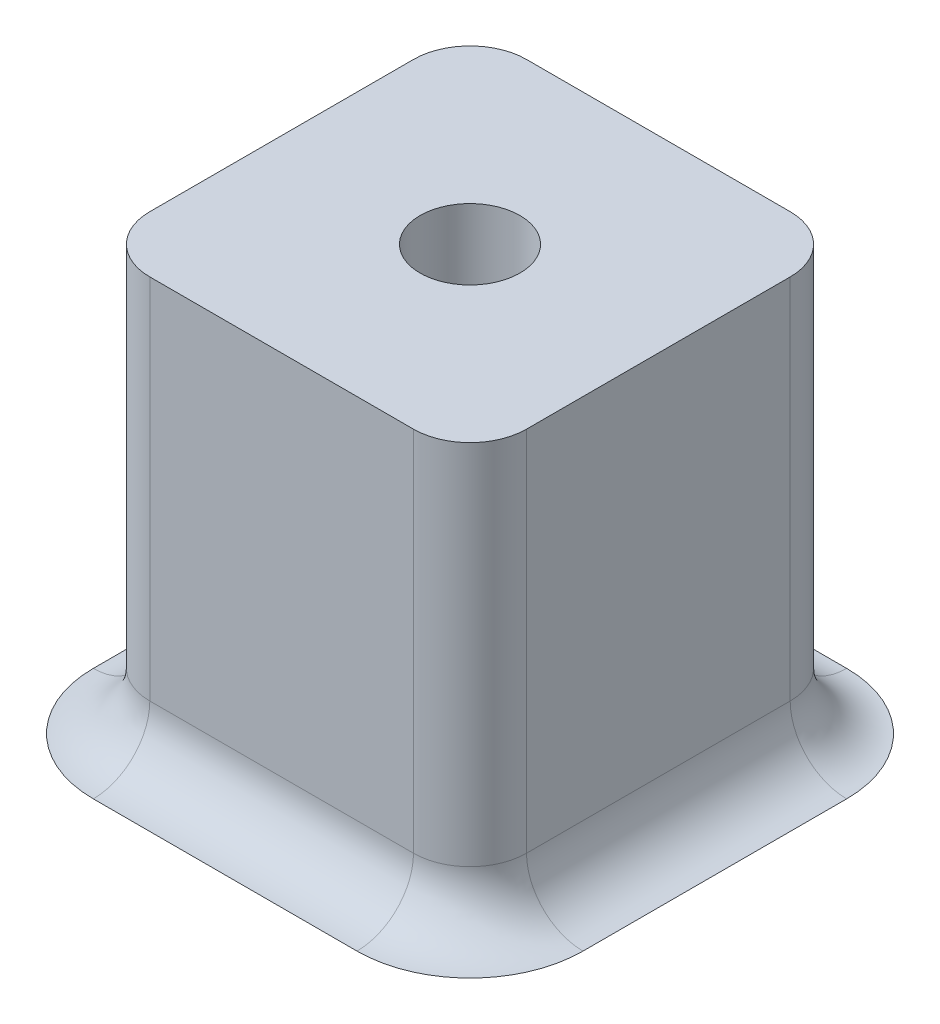
ISO-10303-21;
HEADER;
FILE_DESCRIPTION(('STEP AP214'),'2;1');
FILE_NAME('part.step','',(''),(''),'','','');
FILE_SCHEMA(('AUTOMOTIVE_DESIGN { 1 0 10303 214 1 1 1 1 }'));
ENDSEC;
DATA;
#1=APPLICATION_CONTEXT('core data for automotive mechanical design processes');
#2=APPLICATION_PROTOCOL_DEFINITION('international standard','automotive_design',2000,#1);
#3=PRODUCT_CONTEXT('',#1,'mechanical');
#4=PRODUCT('Part','Part','',(#3));
#5=PRODUCT_RELATED_PRODUCT_CATEGORY('part','',(#4));
#6=PRODUCT_DEFINITION_FORMATION('','',#4);
#7=PRODUCT_DEFINITION_CONTEXT('part definition',#1,'design');
#8=PRODUCT_DEFINITION('design','',#6,#7);
#9=PRODUCT_DEFINITION_SHAPE('','',#8);
#10=(LENGTH_UNIT() NAMED_UNIT(*) SI_UNIT(.MILLI.,.METRE.));
#11=(NAMED_UNIT(*) PLANE_ANGLE_UNIT() SI_UNIT($,.RADIAN.));
#12=(NAMED_UNIT(*) SI_UNIT($,.STERADIAN.) SOLID_ANGLE_UNIT());
#13=UNCERTAINTY_MEASURE_WITH_UNIT(LENGTH_MEASURE(1.E-05),#10,'distance_accuracy_value','');
#14=(GEOMETRIC_REPRESENTATION_CONTEXT(3) GLOBAL_UNCERTAINTY_ASSIGNED_CONTEXT((#13)) GLOBAL_UNIT_ASSIGNED_CONTEXT((#10,
#11,#12)) REPRESENTATION_CONTEXT('',''));
#15=CARTESIAN_POINT('',(0.,0.,0.));
#16=DIRECTION('',(0.,0.,1.));
#17=DIRECTION('',(1.,0.,0.));
#18=AXIS2_PLACEMENT_3D('',#15,#16,#17);
#19=CARTESIAN_POINT('',(865.,5.,-700.));
#20=DIRECTION('',(0.,1.,0.));
#21=DIRECTION('',(0.,0.,1.));
#22=AXIS2_PLACEMENT_3D('',#19,#20,#21);
#23=PLANE('',#22);
#24=DIRECTION('',(1.,0.,0.));
#25=VECTOR('',#24,1.);
#26=CARTESIAN_POINT('',(72.9999999999999,5.,-503.25));
#27=LINE('',#26,#25);
#28=CARTESIAN_POINT('',(86.9999999999999,5.,-503.25));
#29=VERTEX_POINT('',#28);
#30=CARTESIAN_POINT('',(72.9999999999999,5.,-503.25));
#31=VERTEX_POINT('',#30);
#32=EDGE_CURVE('E138',#29,#31,#27,.F.);
#33=ORIENTED_EDGE('',*,*,#32,.T.);
#34=CARTESIAN_POINT('',(72.9999999999999,5.,-509.25));
#35=DIRECTION('',(0.,-1.,0.));
#36=DIRECTION('',(0.,0.,-1.));
#37=AXIS2_PLACEMENT_3D('',#34,#35,#36);
#38=CIRCLE('',#37,6.);
#39=CARTESIAN_POINT('',(66.9999999999999,5.,-509.25));
#40=VERTEX_POINT('',#39);
#41=EDGE_CURVE('E134',#31,#40,#38,.T.);
#42=ORIENTED_EDGE('',*,*,#41,.T.);
#43=DIRECTION('',(0.,0.,1.));
#44=VECTOR('',#43,1.);
#45=CARTESIAN_POINT('',(66.9999999999999,5.,-523.25));
#46=LINE('',#45,#44);
#47=CARTESIAN_POINT('',(66.9999999999999,5.,-523.25));
#48=VERTEX_POINT('',#47);
#49=EDGE_CURVE('E41',#40,#48,#46,.F.);
#50=ORIENTED_EDGE('',*,*,#49,.T.);
#51=CARTESIAN_POINT('',(72.9999999999999,5.,-523.25));
#52=DIRECTION('',(0.,-1.,0.));
#53=DIRECTION('',(0.,0.,-1.));
#54=AXIS2_PLACEMENT_3D('',#51,#52,#53);
#55=CIRCLE('',#54,6.);
#56=CARTESIAN_POINT('',(73.,5.,-529.25));
#57=VERTEX_POINT('',#56);
#58=EDGE_CURVE('E156',#48,#57,#55,.T.);
#59=ORIENTED_EDGE('',*,*,#58,.T.);
#60=DIRECTION('',(1.,0.,0.));
#61=VECTOR('',#60,1.);
#62=CARTESIAN_POINT('',(0.,5.,-529.25));
#63=LINE('',#62,#61);
#64=CARTESIAN_POINT('',(86.9999999999999,5.,-529.25));
#65=VERTEX_POINT('',#64);
#66=EDGE_CURVE('E220',#57,#65,#63,.T.);
#67=ORIENTED_EDGE('',*,*,#66,.T.);
#68=CARTESIAN_POINT('',(86.9999999999999,5.,-523.25));
#69=DIRECTION('',(0.,-1.,0.));
#70=DIRECTION('',(0.,0.,-1.));
#71=AXIS2_PLACEMENT_3D('',#68,#69,#70);
#72=CIRCLE('',#71,6.);
#73=CARTESIAN_POINT('',(92.9999999999999,5.,-523.25));
#74=VERTEX_POINT('',#73);
#75=EDGE_CURVE('E223',#65,#74,#72,.T.);
#76=ORIENTED_EDGE('',*,*,#75,.T.);
#77=DIRECTION('',(0.,0.,1.));
#78=VECTOR('',#77,1.);
#79=CARTESIAN_POINT('',(92.9999999999999,5.,0.));
#80=LINE('',#79,#78);
#81=CARTESIAN_POINT('',(92.9999999999999,5.,-509.25));
#82=VERTEX_POINT('',#81);
#83=EDGE_CURVE('E226',#74,#82,#80,.T.);
#84=ORIENTED_EDGE('',*,*,#83,.T.);
#85=CARTESIAN_POINT('',(86.9999999999999,5.,-509.25));
#86=DIRECTION('',(0.,-1.,0.));
#87=DIRECTION('',(0.,0.,-1.));
#88=AXIS2_PLACEMENT_3D('',#85,#86,#87);
#89=CIRCLE('',#88,6.);
#90=EDGE_CURVE('E229',#82,#29,#89,.T.);
#91=ORIENTED_EDGE('',*,*,#90,.T.);
#92=EDGE_LOOP('',(#33,#42,#50,#59,#67,#76,#84,#91));
#93=FACE_BOUND('',#92,.T.);
#94=CARTESIAN_POINT('',(79.9999999999999,5.,-516.25));
#95=DIRECTION('',(0.,1.,0.));
#96=DIRECTION('',(0.,0.,1.));
#97=AXIS2_PLACEMENT_3D('',#94,#95,#96);
#98=CIRCLE('',#97,2.65000000000002);
#99=CARTESIAN_POINT('',(79.9999999999999,5.,-518.9));
#100=VERTEX_POINT('',#99);
#101=EDGE_CURVE('E195',#100,#100,#98,.T.);
#102=ORIENTED_EDGE('',*,*,#101,.T.);
#103=EDGE_LOOP('',(#102));
#104=FACE_BOUND('',#103,.T.);
#105=ADVANCED_FACE('F38',(#93,#104),#23,.F.);
#106=CARTESIAN_POINT('',(0.,27.5,0.));
#107=DIRECTION('',(0.,1.,0.));
#108=DIRECTION('',(0.,0.,1.));
#109=AXIS2_PLACEMENT_3D('',#106,#107,#108);
#110=PLANE('',#109);
#111=CARTESIAN_POINT('',(79.9999999999999,27.5,-516.25));
#112=DIRECTION('',(0.,1.,0.));
#113=DIRECTION('',(0.,0.,1.));
#114=AXIS2_PLACEMENT_3D('',#111,#112,#113);
#115=CIRCLE('',#114,2.65000000000002);
#116=CARTESIAN_POINT('',(79.9999999999999,27.5,-518.9));
#117=VERTEX_POINT('',#116);
#118=EDGE_CURVE('E199',#117,#117,#115,.T.);
#119=ORIENTED_EDGE('',*,*,#118,.F.);
#120=EDGE_LOOP('',(#119));
#121=FACE_BOUND('',#120,.T.);
#122=DIRECTION('',(1.,0.,0.));
#123=VECTOR('',#122,1.);
#124=CARTESIAN_POINT('',(4.0146457586892E-12,27.5,-506.250000000001));
#125=LINE('',#124,#123);
#126=CARTESIAN_POINT('',(72.9999999999999,27.5,-506.25));
#127=VERTEX_POINT('',#126);
#128=CARTESIAN_POINT('',(86.9999999999999,27.5,-506.25));
#129=VERTEX_POINT('',#128);
#130=EDGE_CURVE('E215',#127,#129,#125,.T.);
#131=ORIENTED_EDGE('',*,*,#130,.T.);
#132=CARTESIAN_POINT('',(86.9999999999999,27.5,-509.25));
#133=DIRECTION('',(0.,1.,0.));
#134=DIRECTION('',(0.,0.,1.));
#135=AXIS2_PLACEMENT_3D('',#132,#133,#134);
#136=CIRCLE('',#135,3.);
#137=CARTESIAN_POINT('',(89.9999999999999,27.5,-509.25));
#138=VERTEX_POINT('',#137);
#139=EDGE_CURVE('E54',#129,#138,#136,.T.);
#140=ORIENTED_EDGE('',*,*,#139,.T.);
#141=DIRECTION('',(0.,0.,1.));
#142=VECTOR('',#141,1.);
#143=CARTESIAN_POINT('',(89.9999999999999,27.5,0.));
#144=LINE('',#143,#142);
#145=CARTESIAN_POINT('',(89.9999999999999,27.5,-523.25));
#146=VERTEX_POINT('',#145);
#147=EDGE_CURVE('E211',#146,#138,#144,.T.);
#148=ORIENTED_EDGE('',*,*,#147,.F.);
#149=CARTESIAN_POINT('',(86.9999999999999,27.5,-523.25));
#150=DIRECTION('',(0.,1.,0.));
#151=DIRECTION('',(0.,0.,1.));
#152=AXIS2_PLACEMENT_3D('',#149,#150,#151);
#153=CIRCLE('',#152,3.);
#154=CARTESIAN_POINT('',(86.9999999999999,27.5,-526.25));
#155=VERTEX_POINT('',#154);
#156=EDGE_CURVE('E208',#155,#146,#153,.F.);
#157=ORIENTED_EDGE('',*,*,#156,.F.);
#158=DIRECTION('',(1.,0.,0.));
#159=VECTOR('',#158,1.);
#160=CARTESIAN_POINT('',(0.,27.5,-526.25));
#161=LINE('',#160,#159);
#162=CARTESIAN_POINT('',(73.,27.5,-526.25));
#163=VERTEX_POINT('',#162);
#164=EDGE_CURVE('E205',#163,#155,#161,.T.);
#165=ORIENTED_EDGE('',*,*,#164,.F.);
#166=CARTESIAN_POINT('',(72.9999999999999,27.5,-523.25));
#167=DIRECTION('',(0.,1.,0.));
#168=DIRECTION('',(0.,0.,1.));
#169=AXIS2_PLACEMENT_3D('',#166,#167,#168);
#170=CIRCLE('',#169,3.);
#171=CARTESIAN_POINT('',(69.9999999999999,27.5,-523.25));
#172=VERTEX_POINT('',#171);
#173=EDGE_CURVE('E203',#163,#172,#170,.T.);
#174=ORIENTED_EDGE('',*,*,#173,.T.);
#175=DIRECTION('',(0.,0.,1.));
#176=VECTOR('',#175,1.);
#177=CARTESIAN_POINT('',(69.9999999999999,27.5,0.));
#178=LINE('',#177,#176);
#179=CARTESIAN_POINT('',(69.9999999999999,27.5,-509.25));
#180=VERTEX_POINT('',#179);
#181=EDGE_CURVE('E201',#172,#180,#178,.T.);
#182=ORIENTED_EDGE('',*,*,#181,.T.);
#183=CARTESIAN_POINT('',(72.9999999999999,27.5,-509.25));
#184=DIRECTION('',(0.,1.,0.));
#185=DIRECTION('',(0.,0.,1.));
#186=AXIS2_PLACEMENT_3D('',#183,#184,#185);
#187=CIRCLE('',#186,3.);
#188=EDGE_CURVE('E194',#180,#127,#187,.T.);
#189=ORIENTED_EDGE('',*,*,#188,.T.);
#190=EDGE_LOOP('',(#131,#140,#148,#157,#165,#174,#182,#189));
#191=FACE_BOUND('',#190,.T.);
#192=ADVANCED_FACE('F258',(#121,#191),#110,.T.);
#193=CARTESIAN_POINT('',(79.9999999999999,27.5,-516.25));
#194=DIRECTION('',(0.,-1.,0.));
#195=DIRECTION('',(0.,0.,-1.));
#196=AXIS2_PLACEMENT_3D('',#193,#194,#195);
#197=CYLINDRICAL_SURFACE('',#196,2.65000000000002);
#198=CARTESIAN_POINT('',(79.9999999999999,27.5,-518.9));
#199=CARTESIAN_POINT('',(79.9999999999999,27.265625,-518.9));
#200=CARTESIAN_POINT('',(79.9999999999999,27.03125,-518.9));
#201=CARTESIAN_POINT('',(79.9999999999999,26.5625,-518.9));
#202=CARTESIAN_POINT('',(79.9999999999999,26.328125,-518.9));
#203=CARTESIAN_POINT('',(79.9999999999999,25.859375,-518.9));
#204=CARTESIAN_POINT('',(79.9999999999999,25.625,-518.9));
#205=CARTESIAN_POINT('',(79.9999999999999,25.15625,-518.9));
#206=CARTESIAN_POINT('',(79.9999999999999,24.921875,-518.9));
#207=CARTESIAN_POINT('',(79.9999999999999,24.453125,-518.9));
#208=CARTESIAN_POINT('',(79.9999999999999,24.21875,-518.9));
#209=CARTESIAN_POINT('',(79.9999999999999,23.75,-518.9));
#210=CARTESIAN_POINT('',(79.9999999999999,23.515625,-518.9));
#211=CARTESIAN_POINT('',(79.9999999999999,23.046875,-518.9));
#212=CARTESIAN_POINT('',(79.9999999999999,22.8125,-518.9));
#213=CARTESIAN_POINT('',(79.9999999999999,22.34375,-518.9));
#214=CARTESIAN_POINT('',(79.9999999999999,22.109375,-518.9));
#215=CARTESIAN_POINT('',(79.9999999999999,21.640625,-518.9));
#216=CARTESIAN_POINT('',(79.9999999999999,21.40625,-518.9));
#217=CARTESIAN_POINT('',(79.9999999999999,20.9375,-518.9));
#218=CARTESIAN_POINT('',(79.9999999999999,20.703125,-518.9));
#219=CARTESIAN_POINT('',(79.9999999999999,20.234375,-518.9));
#220=CARTESIAN_POINT('',(79.9999999999999,20.,-518.9));
#221=CARTESIAN_POINT('',(79.9999999999999,19.53125,-518.9));
#222=CARTESIAN_POINT('',(79.9999999999999,19.296875,-518.9));
#223=CARTESIAN_POINT('',(79.9999999999999,18.828125,-518.9));
#224=CARTESIAN_POINT('',(79.9999999999999,18.59375,-518.9));
#225=CARTESIAN_POINT('',(79.9999999999999,18.125,-518.9));
#226=CARTESIAN_POINT('',(79.9999999999999,17.890625,-518.9));
#227=CARTESIAN_POINT('',(79.9999999999999,17.421875,-518.9));
#228=CARTESIAN_POINT('',(79.9999999999999,17.1875,-518.9));
#229=CARTESIAN_POINT('',(79.9999999999999,16.71875,-518.9));
#230=CARTESIAN_POINT('',(79.9999999999999,16.484375,-518.9));
#231=CARTESIAN_POINT('',(79.9999999999999,16.015625,-518.9));
#232=CARTESIAN_POINT('',(79.9999999999999,15.78125,-518.9));
#233=CARTESIAN_POINT('',(79.9999999999999,15.3125,-518.9));
#234=CARTESIAN_POINT('',(79.9999999999999,15.078125,-518.9));
#235=CARTESIAN_POINT('',(79.9999999999999,14.609375,-518.9));
#236=CARTESIAN_POINT('',(79.9999999999999,14.375,-518.9));
#237=CARTESIAN_POINT('',(79.9999999999999,13.90625,-518.9));
#238=CARTESIAN_POINT('',(79.9999999999999,13.671875,-518.9));
#239=CARTESIAN_POINT('',(79.9999999999999,13.203125,-518.9));
#240=CARTESIAN_POINT('',(79.9999999999999,12.96875,-518.9));
#241=CARTESIAN_POINT('',(79.9999999999999,12.5,-518.9));
#242=CARTESIAN_POINT('',(79.9999999999999,12.265625,-518.9));
#243=CARTESIAN_POINT('',(79.9999999999999,11.796875,-518.9));
#244=CARTESIAN_POINT('',(79.9999999999999,11.5625,-518.9));
#245=CARTESIAN_POINT('',(79.9999999999999,11.09375,-518.9));
#246=CARTESIAN_POINT('',(79.9999999999999,10.859375,-518.9));
#247=CARTESIAN_POINT('',(79.9999999999999,10.390625,-518.9));
#248=CARTESIAN_POINT('',(79.9999999999999,10.15625,-518.9));
#249=CARTESIAN_POINT('',(79.9999999999999,9.6875,-518.9));
#250=CARTESIAN_POINT('',(79.9999999999999,9.453125,-518.9));
#251=CARTESIAN_POINT('',(79.9999999999999,8.984375,-518.9));
#252=CARTESIAN_POINT('',(79.9999999999999,8.75,-518.9));
#253=CARTESIAN_POINT('',(79.9999999999999,8.28125,-518.9));
#254=CARTESIAN_POINT('',(79.9999999999999,8.046875,-518.9));
#255=CARTESIAN_POINT('',(79.9999999999999,7.578125,-518.9));
#256=CARTESIAN_POINT('',(79.9999999999999,7.34375,-518.9));
#257=CARTESIAN_POINT('',(79.9999999999999,6.875,-518.9));
#258=CARTESIAN_POINT('',(79.9999999999999,6.640625,-518.9));
#259=CARTESIAN_POINT('',(79.9999999999999,6.171875,-518.9));
#260=CARTESIAN_POINT('',(79.9999999999999,5.9375,-518.9));
#261=CARTESIAN_POINT('',(79.9999999999999,5.46875,-518.9));
#262=CARTESIAN_POINT('',(79.9999999999999,5.234375,-518.9));
#263=CARTESIAN_POINT('',(79.9999999999999,5.,-518.9));
#264=B_SPLINE_CURVE_WITH_KNOTS('',3,(#198,#199,#200,#201,#202,#203,#204,#205,#206,#207,#208,
#209,#210,#211,#212,#213,#214,#215,#216,#217,#218,#219,#220,#221,#222,#223,#224,#225,#226,#227,
#228,#229,#230,#231,#232,#233,#234,#235,#236,#237,#238,#239,#240,#241,#242,#243,#244,#245,#246,
#247,#248,#249,#250,#251,#252,#253,#254,#255,#256,#257,#258,#259,#260,#261,#262,#263),
.UNSPECIFIED.,.F.,.F.,(4,2,2,2,2,2,2,2,2,2,2,2,2,2,2,2,2,2,2,2,2,2,2,2,2,2,2,2,2,2,2,2,4),(0.,
0.703125000000002,1.40625,2.109375,2.8125,3.515625,4.21875,4.921875,5.625,6.328125,7.03125,
7.734375,8.4375,9.140625,9.84375,10.546875,11.25,11.953125,12.65625,13.359375,14.0625,14.765625,
15.46875,16.171875,16.875,17.578125,18.28125,18.984375,19.6875,20.390625,21.09375,21.796875,
22.5),.UNSPECIFIED.);
#265=EDGE_CURVE('BSEAM282',#117,#100,#264,.T.);
#266=ORIENTED_EDGE('',*,*,#118,.T.);
#267=ORIENTED_EDGE('',*,*,#101,.F.);
#268=ORIENTED_EDGE('',*,*,#265,.T.);
#269=ORIENTED_EDGE('',*,*,#265,.F.);
#270=EDGE_LOOP('',(#266,#268,#267,#269));
#271=FACE_BOUND('',#270,.T.);
#272=ADVANCED_FACE('F282',(#271),#197,.F.);
#273=CARTESIAN_POINT('',(86.9999999999999,27.5,-509.25));
#274=DIRECTION('',(0.,-1.,0.));
#275=DIRECTION('',(0.,0.,-1.));
#276=AXIS2_PLACEMENT_3D('',#273,#274,#275);
#277=CYLINDRICAL_SURFACE('',#276,3.);
#278=DIRECTION('',(0.,-1.,0.));
#279=VECTOR('',#278,1.);
#280=CARTESIAN_POINT('',(86.9999999999999,27.5,-506.25));
#281=LINE('',#280,#279);
#282=CARTESIAN_POINT('',(86.9999999999999,8.00000000000001,-506.25));
#283=VERTEX_POINT('',#282);
#284=EDGE_CURVE('E171',#129,#283,#281,.T.);
#285=ORIENTED_EDGE('',*,*,#284,.T.);
#286=CARTESIAN_POINT('',(86.9999999999999,8.,-509.25));
#287=DIRECTION('',(0.,-1.,0.));
#288=DIRECTION('',(0.,0.,-1.));
#289=AXIS2_PLACEMENT_3D('',#286,#287,#288);
#290=CIRCLE('',#289,3.);
#291=CARTESIAN_POINT('',(89.9999999999999,8.00000000000001,-509.25));
#292=VERTEX_POINT('',#291);
#293=EDGE_CURVE('E160',#283,#292,#290,.F.);
#294=ORIENTED_EDGE('',*,*,#293,.T.);
#295=DIRECTION('',(0.,-1.,0.));
#296=VECTOR('',#295,1.);
#297=CARTESIAN_POINT('',(89.9999999999999,27.5,-509.25));
#298=LINE('',#297,#296);
#299=EDGE_CURVE('E173',#138,#292,#298,.T.);
#300=ORIENTED_EDGE('',*,*,#299,.F.);
#301=ORIENTED_EDGE('',*,*,#139,.F.);
#302=EDGE_LOOP('',(#285,#294,#300,#301));
#303=FACE_BOUND('',#302,.T.);
#304=ADVANCED_FACE('F280',(#303),#277,.T.);
#305=CARTESIAN_POINT('',(89.9999999999999,27.5,0.));
#306=DIRECTION('',(1.,0.,0.));
#307=DIRECTION('',(0.,0.,-1.));
#308=AXIS2_PLACEMENT_3D('',#305,#306,#307);
#309=PLANE('',#308);
#310=ORIENTED_EDGE('',*,*,#299,.T.);
#311=DIRECTION('',(0.,0.,1.));
#312=VECTOR('',#311,1.);
#313=CARTESIAN_POINT('',(89.9999999999999,8.,0.));
#314=LINE('',#313,#312);
#315=CARTESIAN_POINT('',(89.9999999999999,8.00000000000001,-523.25));
#316=VERTEX_POINT('',#315);
#317=EDGE_CURVE('E162',#292,#316,#314,.F.);
#318=ORIENTED_EDGE('',*,*,#317,.T.);
#319=DIRECTION('',(0.,-1.,0.));
#320=VECTOR('',#319,1.);
#321=CARTESIAN_POINT('',(89.9999999999999,27.5,-523.25));
#322=LINE('',#321,#320);
#323=EDGE_CURVE('E176',#146,#316,#322,.T.);
#324=ORIENTED_EDGE('',*,*,#323,.F.);
#325=ORIENTED_EDGE('',*,*,#147,.T.);
#326=EDGE_LOOP('',(#310,#318,#324,#325));
#327=FACE_BOUND('',#326,.T.);
#328=ADVANCED_FACE('F253',(#327),#309,.T.);
#329=CARTESIAN_POINT('',(4.0146457586892E-12,27.5,-506.250000000001));
#330=DIRECTION('',(0.,0.,-1.));
#331=DIRECTION('',(-1.,0.,0.));
#332=AXIS2_PLACEMENT_3D('',#329,#330,#331);
#333=PLANE('',#332);
#334=DIRECTION('',(0.,-1.,0.));
#335=VECTOR('',#334,1.);
#336=CARTESIAN_POINT('',(72.9999999999999,27.5,-506.25));
#337=LINE('',#336,#335);
#338=CARTESIAN_POINT('',(72.9999999999999,8.00000000000001,-506.25));
#339=VERTEX_POINT('',#338);
#340=EDGE_CURVE('E191',#127,#339,#337,.T.);
#341=ORIENTED_EDGE('',*,*,#340,.T.);
#342=DIRECTION('',(1.,0.,0.));
#343=VECTOR('',#342,1.);
#344=CARTESIAN_POINT('',(86.9999999999999,8.,-506.25));
#345=LINE('',#344,#343);
#346=EDGE_CURVE('E158',#339,#283,#345,.T.);
#347=ORIENTED_EDGE('',*,*,#346,.T.);
#348=ORIENTED_EDGE('',*,*,#284,.F.);
#349=ORIENTED_EDGE('',*,*,#130,.F.);
#350=EDGE_LOOP('',(#341,#347,#348,#349));
#351=FACE_BOUND('',#350,.T.);
#352=ADVANCED_FACE('F279',(#351),#333,.F.);
#353=CARTESIAN_POINT('',(86.9999999999999,8.,-509.25));
#354=DIRECTION('',(0.,-1.,0.));
#355=DIRECTION('',(0.,0.,-1.));
#356=AXIS2_PLACEMENT_3D('',#353,#354,#355);
#357=TOROIDAL_SURFACE('',#356,6.,3.);
#358=CARTESIAN_POINT('',(86.9999999999999,8.,-503.25));
#359=DIRECTION('',(1.,0.,0.));
#360=DIRECTION('',(0.,0.,-1.));
#361=AXIS2_PLACEMENT_3D('',#358,#359,#360);
#362=CIRCLE('',#361,3.);
#363=EDGE_CURVE('E239',#29,#283,#362,.T.);
#364=ORIENTED_EDGE('',*,*,#363,.F.);
#365=ORIENTED_EDGE('',*,*,#90,.F.);
#366=CARTESIAN_POINT('',(92.9999999999999,8.,-509.25));
#367=DIRECTION('',(0.,0.,1.));
#368=DIRECTION('',(1.,0.,0.));
#369=AXIS2_PLACEMENT_3D('',#366,#367,#368);
#370=CIRCLE('',#369,3.);
#371=EDGE_CURVE('E198',#292,#82,#370,.T.);
#372=ORIENTED_EDGE('',*,*,#371,.F.);
#373=ORIENTED_EDGE('',*,*,#293,.F.);
#374=EDGE_LOOP('',(#364,#365,#372,#373));
#375=FACE_BOUND('',#374,.T.);
#376=ADVANCED_FACE('F241',(#375),#357,.F.);
#377=CARTESIAN_POINT('',(86.9999999999999,27.5,-523.25));
#378=DIRECTION('',(0.,-1.,0.));
#379=DIRECTION('',(0.,0.,-1.));
#380=AXIS2_PLACEMENT_3D('',#377,#378,#379);
#381=CYLINDRICAL_SURFACE('',#380,3.);
#382=ORIENTED_EDGE('',*,*,#323,.T.);
#383=CARTESIAN_POINT('',(86.9999999999999,8.,-523.25));
#384=DIRECTION('',(0.,-1.,0.));
#385=DIRECTION('',(0.,0.,-1.));
#386=AXIS2_PLACEMENT_3D('',#383,#384,#385);
#387=CIRCLE('',#386,3.);
#388=CARTESIAN_POINT('',(86.9999999999999,8.00000000000001,-526.25));
#389=VERTEX_POINT('',#388);
#390=EDGE_CURVE('E164',#316,#389,#387,.F.);
#391=ORIENTED_EDGE('',*,*,#390,.T.);
#392=DIRECTION('',(0.,-1.,0.));
#393=VECTOR('',#392,1.);
#394=CARTESIAN_POINT('',(86.9999999999999,27.5,-526.25));
#395=LINE('',#394,#393);
#396=EDGE_CURVE('E179',#155,#389,#395,.T.);
#397=ORIENTED_EDGE('',*,*,#396,.F.);
#398=ORIENTED_EDGE('',*,*,#156,.T.);
#399=EDGE_LOOP('',(#382,#391,#397,#398));
#400=FACE_BOUND('',#399,.T.);
#401=ADVANCED_FACE('F255',(#400),#381,.T.);
#402=CARTESIAN_POINT('',(92.9999999999999,8.,0.));
#403=DIRECTION('',(0.,0.,1.));
#404=DIRECTION('',(1.,0.,0.));
#405=AXIS2_PLACEMENT_3D('',#402,#403,#404);
#406=CYLINDRICAL_SURFACE('',#405,3.);
#407=ORIENTED_EDGE('',*,*,#371,.T.);
#408=ORIENTED_EDGE('',*,*,#83,.F.);
#409=CARTESIAN_POINT('',(92.9999999999999,8.,-523.25));
#410=DIRECTION('',(0.,0.,1.));
#411=DIRECTION('',(1.,0.,0.));
#412=AXIS2_PLACEMENT_3D('',#409,#410,#411);
#413=CIRCLE('',#412,3.);
#414=EDGE_CURVE('E242',#316,#74,#413,.T.);
#415=ORIENTED_EDGE('',*,*,#414,.F.);
#416=ORIENTED_EDGE('',*,*,#317,.F.);
#417=EDGE_LOOP('',(#407,#408,#415,#416));
#418=FACE_BOUND('',#417,.T.);
#419=ADVANCED_FACE('F249',(#418),#406,.F.);
#420=CARTESIAN_POINT('',(72.9999999999999,27.5,-509.25));
#421=DIRECTION('',(0.,-1.,0.));
#422=DIRECTION('',(0.,0.,-1.));
#423=AXIS2_PLACEMENT_3D('',#420,#421,#422);
#424=CYLINDRICAL_SURFACE('',#423,3.);
#425=DIRECTION('',(0.,-1.,0.));
#426=VECTOR('',#425,1.);
#427=CARTESIAN_POINT('',(69.9999999999999,27.5,-509.25));
#428=LINE('',#427,#426);
#429=CARTESIAN_POINT('',(69.9999999999999,8.00000000000001,-509.25));
#430=VERTEX_POINT('',#429);
#431=EDGE_CURVE('E188',#180,#430,#428,.T.);
#432=ORIENTED_EDGE('',*,*,#431,.T.);
#433=CARTESIAN_POINT('',(72.9999999999999,8.,-509.25));
#434=DIRECTION('',(0.,-1.,0.));
#435=DIRECTION('',(0.,0.,-1.));
#436=AXIS2_PLACEMENT_3D('',#433,#434,#435);
#437=CIRCLE('',#436,3.);
#438=EDGE_CURVE('E144',#430,#339,#437,.F.);
#439=ORIENTED_EDGE('',*,*,#438,.T.);
#440=ORIENTED_EDGE('',*,*,#340,.F.);
#441=ORIENTED_EDGE('',*,*,#188,.F.);
#442=EDGE_LOOP('',(#432,#439,#440,#441));
#443=FACE_BOUND('',#442,.T.);
#444=ADVANCED_FACE('F275',(#443),#424,.T.);
#445=CARTESIAN_POINT('',(3.99085526530437E-12,8.,-503.250000000001));
#446=DIRECTION('',(-1.,0.,0.));
#447=DIRECTION('',(0.,0.,1.));
#448=AXIS2_PLACEMENT_3D('',#445,#446,#447);
#449=CYLINDRICAL_SURFACE('',#448,3.);
#450=ORIENTED_EDGE('',*,*,#363,.T.);
#451=ORIENTED_EDGE('',*,*,#346,.F.);
#452=CARTESIAN_POINT('',(72.9999999999999,8.,-503.25));
#453=DIRECTION('',(1.,0.,0.));
#454=DIRECTION('',(0.,0.,-1.));
#455=AXIS2_PLACEMENT_3D('',#452,#453,#454);
#456=CIRCLE('',#455,3.);
#457=EDGE_CURVE('E150',#31,#339,#456,.T.);
#458=ORIENTED_EDGE('',*,*,#457,.F.);
#459=ORIENTED_EDGE('',*,*,#32,.F.);
#460=EDGE_LOOP('',(#450,#451,#458,#459));
#461=FACE_BOUND('',#460,.T.);
#462=ADVANCED_FACE('F237',(#461),#449,.F.);
#463=CARTESIAN_POINT('',(0.,27.5,-526.25));
#464=DIRECTION('',(0.,0.,-1.));
#465=DIRECTION('',(-1.,0.,0.));
#466=AXIS2_PLACEMENT_3D('',#463,#464,#465);
#467=PLANE('',#466);
#468=ORIENTED_EDGE('',*,*,#396,.T.);
#469=DIRECTION('',(1.,0.,0.));
#470=VECTOR('',#469,1.);
#471=CARTESIAN_POINT('',(0.,8.,-526.25));
#472=LINE('',#471,#470);
#473=CARTESIAN_POINT('',(73.,8.00000000000001,-526.25));
#474=VERTEX_POINT('',#473);
#475=EDGE_CURVE('E166',#389,#474,#472,.F.);
#476=ORIENTED_EDGE('',*,*,#475,.T.);
#477=DIRECTION('',(0.,-1.,0.));
#478=VECTOR('',#477,1.);
#479=CARTESIAN_POINT('',(73.,27.5,-526.25));
#480=LINE('',#479,#478);
#481=EDGE_CURVE('E182',#163,#474,#480,.T.);
#482=ORIENTED_EDGE('',*,*,#481,.F.);
#483=ORIENTED_EDGE('',*,*,#164,.T.);
#484=EDGE_LOOP('',(#468,#476,#482,#483));
#485=FACE_BOUND('',#484,.T.);
#486=ADVANCED_FACE('F260',(#485),#467,.T.);
#487=CARTESIAN_POINT('',(86.9999999999999,8.,-523.25));
#488=DIRECTION('',(0.,-1.,0.));
#489=DIRECTION('',(0.,0.,-1.));
#490=AXIS2_PLACEMENT_3D('',#487,#488,#489);
#491=TOROIDAL_SURFACE('',#490,6.,3.);
#492=ORIENTED_EDGE('',*,*,#414,.T.);
#493=ORIENTED_EDGE('',*,*,#75,.F.);
#494=CARTESIAN_POINT('',(86.9999999999999,8.,-529.25));
#495=DIRECTION('',(1.,0.,0.));
#496=DIRECTION('',(0.,0.,-1.));
#497=AXIS2_PLACEMENT_3D('',#494,#495,#496);
#498=CIRCLE('',#497,3.);
#499=EDGE_CURVE('E145',#389,#65,#498,.T.);
#500=ORIENTED_EDGE('',*,*,#499,.F.);
#501=ORIENTED_EDGE('',*,*,#390,.F.);
#502=EDGE_LOOP('',(#492,#493,#500,#501));
#503=FACE_BOUND('',#502,.T.);
#504=ADVANCED_FACE('F322',(#503),#491,.F.);
#505=CARTESIAN_POINT('',(69.9999999999999,27.5,0.));
#506=DIRECTION('',(1.,0.,0.));
#507=DIRECTION('',(0.,0.,-1.));
#508=AXIS2_PLACEMENT_3D('',#505,#506,#507);
#509=PLANE('',#508);
#510=DIRECTION('',(0.,-1.,0.));
#511=VECTOR('',#510,1.);
#512=CARTESIAN_POINT('',(69.9999999999999,27.5,-523.25));
#513=LINE('',#512,#511);
#514=CARTESIAN_POINT('',(69.9999999999999,8.00000000000001,-523.25));
#515=VERTEX_POINT('',#514);
#516=EDGE_CURVE('E185',#172,#515,#513,.T.);
#517=ORIENTED_EDGE('',*,*,#516,.T.);
#518=DIRECTION('',(0.,0.,1.));
#519=VECTOR('',#518,1.);
#520=CARTESIAN_POINT('',(69.9999999999999,8.,-509.25));
#521=LINE('',#520,#519);
#522=EDGE_CURVE('E154',#515,#430,#521,.T.);
#523=ORIENTED_EDGE('',*,*,#522,.T.);
#524=ORIENTED_EDGE('',*,*,#431,.F.);
#525=ORIENTED_EDGE('',*,*,#181,.F.);
#526=EDGE_LOOP('',(#517,#523,#524,#525));
#527=FACE_BOUND('',#526,.T.);
#528=ADVANCED_FACE('F273',(#527),#509,.F.);
#529=CARTESIAN_POINT('',(72.9999999999999,8.,-509.25));
#530=DIRECTION('',(0.,-1.,0.));
#531=DIRECTION('',(0.,0.,-1.));
#532=AXIS2_PLACEMENT_3D('',#529,#530,#531);
#533=TOROIDAL_SURFACE('',#532,6.,3.);
#534=ORIENTED_EDGE('',*,*,#457,.T.);
#535=ORIENTED_EDGE('',*,*,#438,.F.);
#536=CARTESIAN_POINT('',(66.9999999999999,8.,-509.25));
#537=DIRECTION('',(0.,0.,1.));
#538=DIRECTION('',(1.,0.,0.));
#539=AXIS2_PLACEMENT_3D('',#536,#537,#538);
#540=CIRCLE('',#539,3.);
#541=EDGE_CURVE('E131',#40,#430,#540,.T.);
#542=ORIENTED_EDGE('',*,*,#541,.F.);
#543=ORIENTED_EDGE('',*,*,#41,.F.);
#544=EDGE_LOOP('',(#534,#535,#542,#543));
#545=FACE_BOUND('',#544,.T.);
#546=ADVANCED_FACE('F143',(#545),#533,.F.);
#547=CARTESIAN_POINT('',(72.9999999999999,27.5,-523.25));
#548=DIRECTION('',(0.,-1.,0.));
#549=DIRECTION('',(0.,0.,-1.));
#550=AXIS2_PLACEMENT_3D('',#547,#548,#549);
#551=CYLINDRICAL_SURFACE('',#550,3.);
#552=ORIENTED_EDGE('',*,*,#481,.T.);
#553=CARTESIAN_POINT('',(72.9999999999999,8.,-523.25));
#554=DIRECTION('',(0.,-1.,0.));
#555=DIRECTION('',(0.,0.,-1.));
#556=AXIS2_PLACEMENT_3D('',#553,#554,#555);
#557=CIRCLE('',#556,3.);
#558=EDGE_CURVE('E168',#474,#515,#557,.F.);
#559=ORIENTED_EDGE('',*,*,#558,.T.);
#560=ORIENTED_EDGE('',*,*,#516,.F.);
#561=ORIENTED_EDGE('',*,*,#173,.F.);
#562=EDGE_LOOP('',(#552,#559,#560,#561));
#563=FACE_BOUND('',#562,.T.);
#564=ADVANCED_FACE('F267',(#563),#551,.T.);
#565=CARTESIAN_POINT('',(66.9999999999999,8.,0.));
#566=DIRECTION('',(0.,0.,-1.));
#567=DIRECTION('',(-1.,0.,0.));
#568=AXIS2_PLACEMENT_3D('',#565,#566,#567);
#569=CYLINDRICAL_SURFACE('',#568,3.);
#570=ORIENTED_EDGE('',*,*,#541,.T.);
#571=ORIENTED_EDGE('',*,*,#522,.F.);
#572=CARTESIAN_POINT('',(66.9999999999999,8.,-523.25));
#573=DIRECTION('',(0.,0.,1.));
#574=DIRECTION('',(1.,0.,0.));
#575=AXIS2_PLACEMENT_3D('',#572,#573,#574);
#576=CIRCLE('',#575,3.);
#577=EDGE_CURVE('E11',#48,#515,#576,.T.);
#578=ORIENTED_EDGE('',*,*,#577,.F.);
#579=ORIENTED_EDGE('',*,*,#49,.F.);
#580=EDGE_LOOP('',(#570,#571,#578,#579));
#581=FACE_BOUND('',#580,.T.);
#582=ADVANCED_FACE('F128',(#581),#569,.F.);
#583=CARTESIAN_POINT('',(0.,8.,-529.25));
#584=DIRECTION('',(1.,0.,0.));
#585=DIRECTION('',(0.,0.,-1.));
#586=AXIS2_PLACEMENT_3D('',#583,#584,#585);
#587=CYLINDRICAL_SURFACE('',#586,3.);
#588=ORIENTED_EDGE('',*,*,#499,.T.);
#589=ORIENTED_EDGE('',*,*,#66,.F.);
#590=CARTESIAN_POINT('',(73.,8.,-529.25));
#591=DIRECTION('',(1.,0.,0.));
#592=DIRECTION('',(0.,1.,0.));
#593=AXIS2_PLACEMENT_3D('',#590,#591,#592);
#594=CIRCLE('',#593,3.);
#595=EDGE_CURVE('E46',#474,#57,#594,.T.);
#596=ORIENTED_EDGE('',*,*,#595,.F.);
#597=ORIENTED_EDGE('',*,*,#475,.F.);
#598=EDGE_LOOP('',(#588,#589,#596,#597));
#599=FACE_BOUND('',#598,.T.);
#600=ADVANCED_FACE('F299',(#599),#587,.F.);
#601=CARTESIAN_POINT('',(72.9999999999999,8.,-523.25));
#602=DIRECTION('',(0.,-1.,0.));
#603=DIRECTION('',(0.,0.,-1.));
#604=AXIS2_PLACEMENT_3D('',#601,#602,#603);
#605=TOROIDAL_SURFACE('',#604,6.,3.);
#606=ORIENTED_EDGE('',*,*,#595,.T.);
#607=ORIENTED_EDGE('',*,*,#58,.F.);
#608=ORIENTED_EDGE('',*,*,#577,.T.);
#609=ORIENTED_EDGE('',*,*,#558,.F.);
#610=EDGE_LOOP('',(#606,#607,#608,#609));
#611=FACE_BOUND('',#610,.T.);
#612=ADVANCED_FACE('F293',(#611),#605,.F.);
#613=CLOSED_SHELL('',(#105,#192,#272,#304,#328,#352,#376,#401,#419,#444,#462,#486,#504,#528,
#546,#564,#582,#600,#612));
#614=MANIFOLD_SOLID_BREP('B2',#613);
#615=ADVANCED_BREP_SHAPE_REPRESENTATION('',(#18,#614),#14);
#616=SHAPE_DEFINITION_REPRESENTATION(#9,#615);
ENDSEC;
END-ISO-10303-21;
